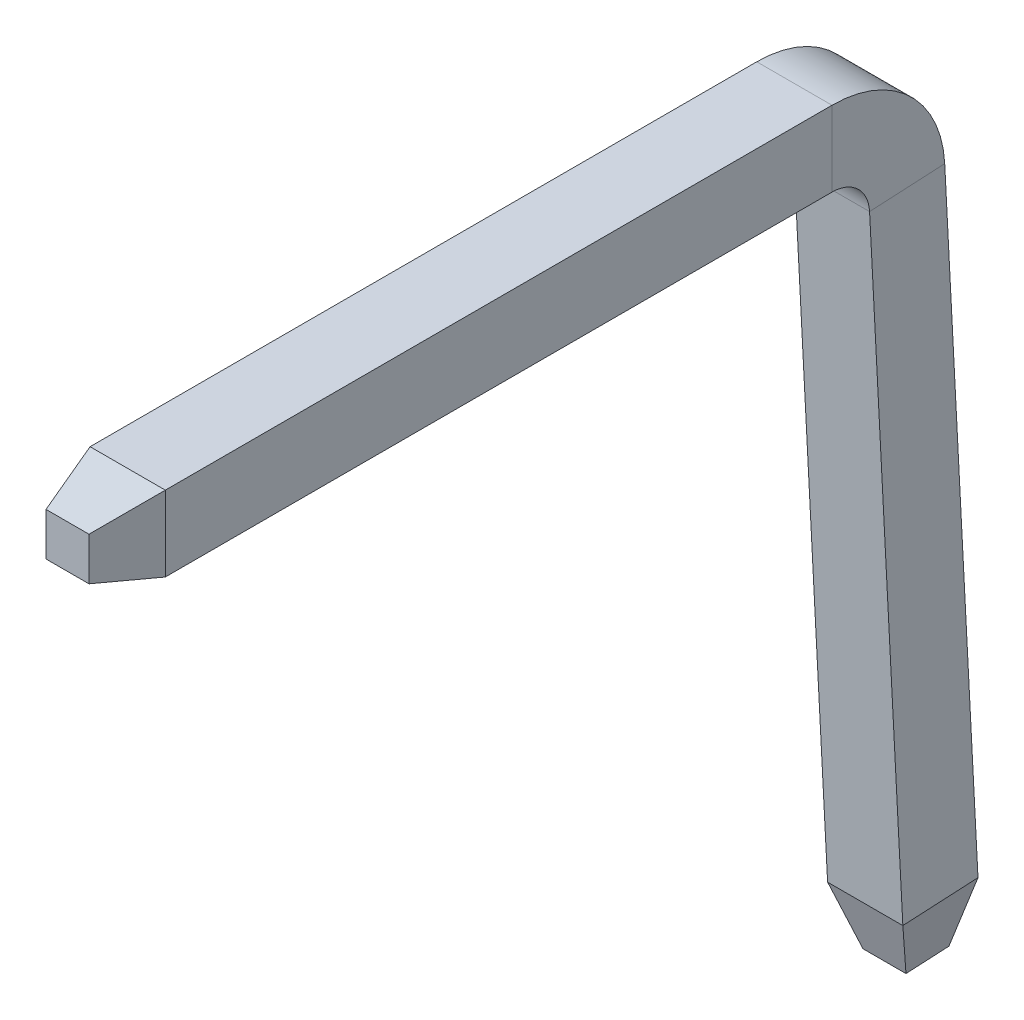
ISO-10303-21;
HEADER;
FILE_DESCRIPTION(('STEP AP214'),'2;1');
FILE_NAME('part.step','',(''),(''),'','','');
FILE_SCHEMA(('AUTOMOTIVE_DESIGN { 1 0 10303 214 1 1 1 1 }'));
ENDSEC;
DATA;
#1=APPLICATION_CONTEXT('core data for automotive mechanical design processes');
#2=APPLICATION_PROTOCOL_DEFINITION('international standard','automotive_design',2000,#1);
#3=PRODUCT_CONTEXT('',#1,'mechanical');
#4=PRODUCT('Part','Part','',(#3));
#5=PRODUCT_RELATED_PRODUCT_CATEGORY('part','',(#4));
#6=PRODUCT_DEFINITION_FORMATION('','',#4);
#7=PRODUCT_DEFINITION_CONTEXT('part definition',#1,'design');
#8=PRODUCT_DEFINITION('design','',#6,#7);
#9=PRODUCT_DEFINITION_SHAPE('','',#8);
#10=(LENGTH_UNIT() NAMED_UNIT(*) SI_UNIT(.MILLI.,.METRE.));
#11=(NAMED_UNIT(*) PLANE_ANGLE_UNIT() SI_UNIT($,.RADIAN.));
#12=(NAMED_UNIT(*) SI_UNIT($,.STERADIAN.) SOLID_ANGLE_UNIT());
#13=UNCERTAINTY_MEASURE_WITH_UNIT(LENGTH_MEASURE(1.E-05),#10,'distance_accuracy_value','');
#14=(GEOMETRIC_REPRESENTATION_CONTEXT(3) GLOBAL_UNCERTAINTY_ASSIGNED_CONTEXT((#13)) GLOBAL_UNIT_ASSIGNED_CONTEXT((#10,
#11,#12)) REPRESENTATION_CONTEXT('',''));
#15=CARTESIAN_POINT('',(0.,0.,0.));
#16=DIRECTION('',(0.,0.,1.));
#17=DIRECTION('',(1.,0.,0.));
#18=AXIS2_PLACEMENT_3D('',#15,#16,#17);
#19=CARTESIAN_POINT('',(115.271683739299,78.5058697660205,16.2562775900884));
#20=DIRECTION('',(0.965925826289341,0.,0.258819045101502));
#21=DIRECTION('',(0.,-1.,0.));
#22=AXIS2_PLACEMENT_3D('',#19,#20,#21);
#23=PLANE('',#22);
#24=DIRECTION('',(0.,1.,0.));
#25=VECTOR('',#24,1.);
#26=CARTESIAN_POINT('',(115.325273577785,78.2558697660205,16.0562775900884));
#27=LINE('',#26,#25);
#28=CARTESIAN_POINT('',(115.325273577785,78.2558697660205,16.0562775900884));
#29=VERTEX_POINT('',#28);
#30=CARTESIAN_POINT('',(115.325273577785,78.7558697660205,16.0562775900884));
#31=VERTEX_POINT('',#30);
#32=EDGE_CURVE('E214',#29,#31,#27,.T.);
#33=ORIENTED_EDGE('',*,*,#32,.T.);
#34=DIRECTION('',(-0.250562807084776,-0.250562807084838,0.935113126531525));
#35=VECTOR('',#34,1.);
#36=CARTESIAN_POINT('',(115.325273577785,78.7558697660205,16.0562775900884));
#37=LINE('',#36,#35);
#38=CARTESIAN_POINT('',(115.218093900813,78.6486900890485,16.4562775900884));
#39=VERTEX_POINT('',#38);
#40=EDGE_CURVE('E11',#31,#39,#37,.T.);
#41=ORIENTED_EDGE('',*,*,#40,.T.);
#42=DIRECTION('',(0.,-1.,0.));
#43=VECTOR('',#42,1.);
#44=CARTESIAN_POINT('',(115.218093900813,78.6486900890485,16.4562775900884));
#45=LINE('',#44,#43);
#46=CARTESIAN_POINT('',(115.218093900813,78.3630494429925,16.4562775900884));
#47=VERTEX_POINT('',#46);
#48=EDGE_CURVE('E169',#39,#47,#45,.T.);
#49=ORIENTED_EDGE('',*,*,#48,.T.);
#50=DIRECTION('',(0.250562807084781,-0.25056280708476,-0.935113126531544));
#51=VECTOR('',#50,1.);
#52=CARTESIAN_POINT('',(115.218093900813,78.3630494429925,16.4562775900884));
#53=LINE('',#52,#51);
#54=EDGE_CURVE('E50',#47,#29,#53,.T.);
#55=ORIENTED_EDGE('',*,*,#54,.T.);
#56=EDGE_LOOP('',(#33,#41,#49,#55));
#57=FACE_BOUND('',#56,.T.);
#58=ADVANCED_FACE('F40',(#57),#23,.T.);
#59=CARTESIAN_POINT('',(115.075273577785,78.7022799275345,16.2562775900884));
#60=DIRECTION('',(0.,0.965925826289331,0.25881904510154));
#61=DIRECTION('',(1.,0.,0.));
#62=AXIS2_PLACEMENT_3D('',#59,#60,#61);
#63=PLANE('',#62);
#64=DIRECTION('',(1.,0.,0.));
#65=VECTOR('',#64,1.);
#66=CARTESIAN_POINT('',(114.932453254757,78.6486900890485,16.4562775900884));
#67=LINE('',#66,#65);
#68=CARTESIAN_POINT('',(114.932453254757,78.6486900890485,16.4562775900884));
#69=VERTEX_POINT('',#68);
#70=EDGE_CURVE('E44',#69,#39,#67,.T.);
#71=ORIENTED_EDGE('',*,*,#70,.T.);
#72=ORIENTED_EDGE('',*,*,#40,.F.);
#73=DIRECTION('',(-1.,0.,0.));
#74=VECTOR('',#73,1.);
#75=CARTESIAN_POINT('',(115.325273577785,78.7558697660205,16.0562775900884));
#76=LINE('',#75,#74);
#77=CARTESIAN_POINT('',(114.825273577785,78.7558697660205,16.0562775900885));
#78=VERTEX_POINT('',#77);
#79=EDGE_CURVE('E185',#31,#78,#76,.T.);
#80=ORIENTED_EDGE('',*,*,#79,.T.);
#81=DIRECTION('',(0.250562807084861,-0.25056280708484,0.935113126531502));
#82=VECTOR('',#81,1.);
#83=CARTESIAN_POINT('',(114.825273577785,78.7558697660205,16.0562775900885));
#84=LINE('',#83,#82);
#85=EDGE_CURVE('E96',#78,#69,#84,.T.);
#86=ORIENTED_EDGE('',*,*,#85,.T.);
#87=EDGE_LOOP('',(#71,#72,#80,#86));
#88=FACE_BOUND('',#87,.T.);
#89=ADVANCED_FACE('F42',(#88),#63,.T.);
#90=CARTESIAN_POINT('',(115.075273577785,78.3094596045065,16.2562775900884));
#91=DIRECTION('',(0.,-0.965925826289338,0.258819045101513));
#92=DIRECTION('',(-1.,0.,0.));
#93=AXIS2_PLACEMENT_3D('',#90,#91,#92);
#94=PLANE('',#93);
#95=DIRECTION('',(1.,0.,0.));
#96=VECTOR('',#95,1.);
#97=CARTESIAN_POINT('',(114.825273577785,78.2558697660205,16.0562775900885));
#98=LINE('',#97,#96);
#99=CARTESIAN_POINT('',(114.825273577785,78.2558697660205,16.0562775900885));
#100=VERTEX_POINT('',#99);
#101=EDGE_CURVE('E190',#100,#29,#98,.T.);
#102=ORIENTED_EDGE('',*,*,#101,.T.);
#103=ORIENTED_EDGE('',*,*,#54,.F.);
#104=DIRECTION('',(-1.,0.,0.));
#105=VECTOR('',#104,1.);
#106=CARTESIAN_POINT('',(115.218093900813,78.3630494429925,16.4562775900884));
#107=LINE('',#106,#105);
#108=CARTESIAN_POINT('',(114.932453254757,78.3630494429925,16.4562775900884));
#109=VERTEX_POINT('',#108);
#110=EDGE_CURVE('E167',#47,#109,#107,.T.);
#111=ORIENTED_EDGE('',*,*,#110,.T.);
#112=DIRECTION('',(-0.250562807084866,-0.250562807084762,-0.935113126531521));
#113=VECTOR('',#112,1.);
#114=CARTESIAN_POINT('',(114.932453254757,78.3630494429925,16.4562775900884));
#115=LINE('',#114,#113);
#116=EDGE_CURVE('E144',#109,#100,#115,.T.);
#117=ORIENTED_EDGE('',*,*,#116,.T.);
#118=EDGE_LOOP('',(#102,#103,#111,#117));
#119=FACE_BOUND('',#118,.T.);
#120=ADVANCED_FACE('F277',(#119),#94,.T.);
#121=CARTESIAN_POINT('',(114.878863416271,78.5058697660205,16.2562775900884));
#122=DIRECTION('',(-0.965925826289328,0.,0.258819045101551));
#123=DIRECTION('',(0.,1.,0.));
#124=AXIS2_PLACEMENT_3D('',#121,#122,#123);
#125=PLANE('',#124);
#126=DIRECTION('',(0.,-1.,0.));
#127=VECTOR('',#126,1.);
#128=CARTESIAN_POINT('',(114.825273577785,78.7558697660205,16.0562775900885));
#129=LINE('',#128,#127);
#130=EDGE_CURVE('E159',#78,#100,#129,.T.);
#131=ORIENTED_EDGE('',*,*,#130,.T.);
#132=ORIENTED_EDGE('',*,*,#116,.F.);
#133=DIRECTION('',(0.,1.,0.));
#134=VECTOR('',#133,1.);
#135=CARTESIAN_POINT('',(114.932453254757,78.3630494429925,16.4562775900884));
#136=LINE('',#135,#134);
#137=EDGE_CURVE('E170',#109,#69,#136,.T.);
#138=ORIENTED_EDGE('',*,*,#137,.T.);
#139=ORIENTED_EDGE('',*,*,#85,.F.);
#140=EDGE_LOOP('',(#131,#132,#138,#139));
#141=FACE_BOUND('',#140,.T.);
#142=ADVANCED_FACE('F271',(#141),#125,.T.);
#143=CARTESIAN_POINT('',(115.271683739299,73.613070311148,10.8954677825284));
#144=DIRECTION('',(0.965925826289371,-0.258464342595238,-0.0135455422190501));
#145=DIRECTION('',(0.,0.0523359562421059,-0.998629534754618));
#146=AXIS2_PLACEMENT_3D('',#143,#144,#145);
#147=PLANE('',#146);
#148=DIRECTION('',(0.250562807084597,0.920718142383397,0.299159459138357));
#149=VECTOR('',#148,1.);
#150=CARTESIAN_POINT('',(115.218093900813,73.4058697660205,11.0276251840184));
#151=LINE('',#150,#149);
#152=CARTESIAN_POINT('',(115.218093900813,73.4058697660205,11.0276251840184));
#153=VERTEX_POINT('',#152);
#154=CARTESIAN_POINT('',(115.325273577785,73.7997122290385,11.1555923574655));
#155=VERTEX_POINT('',#154);
#156=EDGE_CURVE('E145',#153,#155,#151,.T.);
#157=ORIENTED_EDGE('',*,*,#156,.F.);
#158=DIRECTION('',(1.24377035546788E-13,-0.0523359562423446,0.998629534754605));
#159=VECTOR('',#158,1.);
#160=CARTESIAN_POINT('',(115.218093900813,73.4208190423735,10.7423759985414));
#161=LINE('',#160,#159);
#162=CARTESIAN_POINT('',(115.218093900813,73.4208190423735,10.7423759985414));
#163=VERTEX_POINT('',#162);
#164=EDGE_CURVE('E151',#163,#153,#161,.T.);
#165=ORIENTED_EDGE('',*,*,#164,.F.);
#166=DIRECTION('',(-0.250562807084773,-0.946945030598568,0.201279379794542));
#167=VECTOR('',#166,1.);
#168=CARTESIAN_POINT('',(115.325273577785,73.8258802071595,10.6562775900885));
#169=LINE('',#168,#167);
#170=CARTESIAN_POINT('',(115.325273577785,73.8258802071595,10.6562775900885));
#171=VERTEX_POINT('',#170);
#172=EDGE_CURVE('E133',#171,#163,#169,.T.);
#173=ORIENTED_EDGE('',*,*,#172,.F.);
#174=DIRECTION('',(0.,-0.0523359562420613,0.99862953475462));
#175=VECTOR('',#174,1.);
#176=CARTESIAN_POINT('',(115.325273577785,73.8258802071595,10.6562775900885));
#177=LINE('',#176,#175);
#178=EDGE_CURVE('E172',#171,#155,#177,.T.);
#179=ORIENTED_EDGE('',*,*,#178,.T.);
#180=EDGE_LOOP('',(#157,#165,#173,#179));
#181=FACE_BOUND('',#180,.T.);
#182=ADVANCED_FACE('F155',(#181),#147,.T.);
#183=CARTESIAN_POINT('',(115.075273577785,73.6233496247665,10.6993267943149));
#184=DIRECTION('',(0.,-0.207911690817772,-0.978147600733803));
#185=DIRECTION('',(0.,-0.978147600733803,0.207911690817772));
#186=AXIS2_PLACEMENT_3D('',#183,#184,#185);
#187=PLANE('',#186);
#188=DIRECTION('',(0.250562807084695,-0.946945030598588,0.201279379794547));
#189=VECTOR('',#188,1.);
#190=CARTESIAN_POINT('',(114.825273577785,73.8258802071595,10.6562775900885));
#191=LINE('',#190,#189);
#192=CARTESIAN_POINT('',(114.825273577785,73.8258802071595,10.6562775900885));
#193=VERTEX_POINT('',#192);
#194=CARTESIAN_POINT('',(114.932453254757,73.4208190423735,10.7423759985414));
#195=VERTEX_POINT('',#194);
#196=EDGE_CURVE('E240',#193,#195,#191,.T.);
#197=ORIENTED_EDGE('',*,*,#196,.F.);
#198=DIRECTION('',(1.,0.,0.));
#199=VECTOR('',#198,1.);
#200=CARTESIAN_POINT('',(114.825273577785,73.8258802071595,10.6562775900885));
#201=LINE('',#200,#199);
#202=EDGE_CURVE('E139',#193,#171,#201,.T.);
#203=ORIENTED_EDGE('',*,*,#202,.T.);
#204=ORIENTED_EDGE('',*,*,#172,.T.);
#205=DIRECTION('',(1.,0.,0.));
#206=VECTOR('',#205,1.);
#207=CARTESIAN_POINT('',(114.932453254757,73.4208190423735,10.7423759985414));
#208=LINE('',#207,#206);
#209=EDGE_CURVE('E136',#195,#163,#208,.T.);
#210=ORIENTED_EDGE('',*,*,#209,.F.);
#211=EDGE_LOOP('',(#197,#203,#204,#210));
#212=FACE_BOUND('',#211,.T.);
#213=ADVANCED_FACE('F135',(#212),#187,.T.);
#214=CARTESIAN_POINT('',(115.075273577785,73.6027909975295,11.091608770742));
#215=DIRECTION('',(0.,-0.309016994374012,0.951056516295458));
#216=DIRECTION('',(-1.,0.,0.));
#217=AXIS2_PLACEMENT_3D('',#214,#215,#216);
#218=PLANE('',#217);
#219=DIRECTION('',(-0.250562807084636,0.920718142383387,0.299159459138353));
#220=VECTOR('',#219,1.);
#221=CARTESIAN_POINT('',(114.932453254757,73.4058697660205,11.0276251840184));
#222=LINE('',#221,#220);
#223=CARTESIAN_POINT('',(114.932453254757,73.4058697660205,11.0276251840184));
#224=VERTEX_POINT('',#223);
#225=CARTESIAN_POINT('',(114.825273577785,73.7997122290385,11.1555923574655));
#226=VERTEX_POINT('',#225);
#227=EDGE_CURVE('E239',#224,#226,#222,.T.);
#228=ORIENTED_EDGE('',*,*,#227,.F.);
#229=DIRECTION('',(-1.,0.,0.));
#230=VECTOR('',#229,1.);
#231=CARTESIAN_POINT('',(115.218093900813,73.4058697660205,11.0276251840184));
#232=LINE('',#231,#230);
#233=EDGE_CURVE('E158',#153,#224,#232,.T.);
#234=ORIENTED_EDGE('',*,*,#233,.F.);
#235=ORIENTED_EDGE('',*,*,#156,.T.);
#236=DIRECTION('',(-1.,0.,0.));
#237=VECTOR('',#236,1.);
#238=CARTESIAN_POINT('',(115.325273577785,73.7997122290385,11.1555923574655));
#239=LINE('',#238,#237);
#240=EDGE_CURVE('E192',#155,#226,#239,.T.);
#241=ORIENTED_EDGE('',*,*,#240,.T.);
#242=EDGE_LOOP('',(#228,#234,#235,#241));
#243=FACE_BOUND('',#242,.T.);
#244=ADVANCED_FACE('F343',(#243),#218,.T.);
#245=CARTESIAN_POINT('',(114.878863416271,73.6130703111481,10.8954677825285));
#246=DIRECTION('',(-0.965925826289363,-0.258464342595269,-0.013545542219036));
#247=DIRECTION('',(-0.258488057599066,0.966014453348739,0.));
#248=AXIS2_PLACEMENT_3D('',#245,#246,#247);
#249=PLANE('',#248);
#250=ORIENTED_EDGE('',*,*,#196,.T.);
#251=DIRECTION('',(0.,0.0523359562423446,-0.998629534754605));
#252=VECTOR('',#251,1.);
#253=CARTESIAN_POINT('',(114.932453254757,73.4058697660205,11.0276251840184));
#254=LINE('',#253,#252);
#255=EDGE_CURVE('E153',#224,#195,#254,.T.);
#256=ORIENTED_EDGE('',*,*,#255,.F.);
#257=ORIENTED_EDGE('',*,*,#227,.T.);
#258=DIRECTION('',(0.,0.0523359562420613,-0.99862953475462));
#259=VECTOR('',#258,1.);
#260=CARTESIAN_POINT('',(114.825273577785,73.7997122290385,11.1555923574655));
#261=LINE('',#260,#259);
#262=EDGE_CURVE('E195',#226,#193,#261,.T.);
#263=ORIENTED_EDGE('',*,*,#262,.T.);
#264=EDGE_LOOP('',(#250,#256,#257,#263));
#265=FACE_BOUND('',#264,.T.);
#266=ADVANCED_FACE('F325',(#265),#249,.T.);
#267=CARTESIAN_POINT('',(115.075273577785,78.5058697660205,16.4562775900884));
#268=DIRECTION('',(0.,0.,1.));
#269=DIRECTION('',(1.,0.,0.));
#270=AXIS2_PLACEMENT_3D('',#267,#268,#269);
#271=PLANE('',#270);
#272=ORIENTED_EDGE('',*,*,#70,.F.);
#273=ORIENTED_EDGE('',*,*,#137,.F.);
#274=ORIENTED_EDGE('',*,*,#110,.F.);
#275=ORIENTED_EDGE('',*,*,#48,.F.);
#276=EDGE_LOOP('',(#272,#273,#274,#275));
#277=FACE_BOUND('',#276,.T.);
#278=ADVANCED_FACE('F275',(#277),#271,.T.);
#279=CARTESIAN_POINT('',(115.218093900813,73.413344404197,10.8850005912799));
#280=DIRECTION('',(0.,-0.9986295347546,-0.0523359562424376));
#281=DIRECTION('',(0.,0.0523359562424376,-0.9986295347546));
#282=AXIS2_PLACEMENT_3D('',#279,#280,#281);
#283=PLANE('',#282);
#284=ORIENTED_EDGE('',*,*,#164,.T.);
#285=ORIENTED_EDGE('',*,*,#233,.T.);
#286=ORIENTED_EDGE('',*,*,#255,.T.);
#287=ORIENTED_EDGE('',*,*,#209,.T.);
#288=EDGE_LOOP('',(#284,#285,#286,#287));
#289=FACE_BOUND('',#288,.T.);
#290=ADVANCED_FACE('F149',(#289),#283,.T.);
#291=CARTESIAN_POINT('',(114.825273577785,78.5058697660205,13.8413242049409));
#292=DIRECTION('',(-1.,0.,0.));
#293=DIRECTION('',(0.,1.,0.));
#294=AXIS2_PLACEMENT_3D('',#291,#292,#293);
#295=PLANE('',#294);
#296=DIRECTION('',(0.,0.,1.));
#297=VECTOR('',#296,1.);
#298=CARTESIAN_POINT('',(114.825273577785,78.2558697660205,11.6263708197935));
#299=LINE('',#298,#297);
#300=CARTESIAN_POINT('',(114.825273577785,78.2558697660205,11.6263708197935));
#301=VERTEX_POINT('',#300);
#302=EDGE_CURVE('E162',#301,#100,#299,.T.);
#303=ORIENTED_EDGE('',*,*,#302,.T.);
#304=ORIENTED_EDGE('',*,*,#130,.F.);
#305=DIRECTION('',(0.,0.,-1.));
#306=VECTOR('',#305,1.);
#307=CARTESIAN_POINT('',(114.825273577785,78.7558697660205,16.0562775900885));
#308=LINE('',#307,#306);
#309=CARTESIAN_POINT('',(114.825273577785,78.7558697660205,11.6263708197935));
#310=VERTEX_POINT('',#309);
#311=EDGE_CURVE('E188',#78,#310,#308,.T.);
#312=ORIENTED_EDGE('',*,*,#311,.T.);
#313=DIRECTION('',(0.,-1.,0.));
#314=VECTOR('',#313,1.);
#315=CARTESIAN_POINT('',(114.825273577785,78.7558697660205,11.6263708197935));
#316=LINE('',#315,#314);
#317=EDGE_CURVE('E237',#310,#301,#316,.T.);
#318=ORIENTED_EDGE('',*,*,#317,.T.);
#319=EDGE_LOOP('',(#303,#304,#312,#318));
#320=FACE_BOUND('',#319,.T.);
#321=ADVANCED_FACE('F284',(#320),#295,.T.);
#322=CARTESIAN_POINT('',(115.075273577785,78.2558697660205,13.8413242049409));
#323=DIRECTION('',(0.,-1.,0.));
#324=DIRECTION('',(0.,0.,-1.));
#325=AXIS2_PLACEMENT_3D('',#322,#323,#324);
#326=PLANE('',#325);
#327=DIRECTION('',(0.,0.,1.));
#328=VECTOR('',#327,1.);
#329=CARTESIAN_POINT('',(115.325273577785,78.2558697660205,11.6263708197935));
#330=LINE('',#329,#328);
#331=CARTESIAN_POINT('',(115.325273577785,78.2558697660205,11.6263708197935));
#332=VERTEX_POINT('',#331);
#333=EDGE_CURVE('E215',#332,#29,#330,.T.);
#334=ORIENTED_EDGE('',*,*,#333,.T.);
#335=ORIENTED_EDGE('',*,*,#101,.F.);
#336=ORIENTED_EDGE('',*,*,#302,.F.);
#337=DIRECTION('',(1.,0.,0.));
#338=VECTOR('',#337,1.);
#339=CARTESIAN_POINT('',(114.825273577785,78.2558697660205,11.6263708197935));
#340=LINE('',#339,#338);
#341=EDGE_CURVE('E180',#301,#332,#340,.T.);
#342=ORIENTED_EDGE('',*,*,#341,.T.);
#343=EDGE_LOOP('',(#334,#335,#336,#342));
#344=FACE_BOUND('',#343,.T.);
#345=ADVANCED_FACE('F280',(#344),#326,.T.);
#346=CARTESIAN_POINT('',(115.325273577785,78.5058697660205,13.8413242049409));
#347=DIRECTION('',(1.,0.,0.));
#348=DIRECTION('',(0.,0.,-1.));
#349=AXIS2_PLACEMENT_3D('',#346,#347,#348);
#350=PLANE('',#349);
#351=DIRECTION('',(0.,0.,1.));
#352=VECTOR('',#351,1.);
#353=CARTESIAN_POINT('',(115.325273577785,78.7558697660205,11.6263708197935));
#354=LINE('',#353,#352);
#355=CARTESIAN_POINT('',(115.325273577785,78.7558697660205,11.6263708197935));
#356=VERTEX_POINT('',#355);
#357=EDGE_CURVE('E187',#356,#31,#354,.T.);
#358=ORIENTED_EDGE('',*,*,#357,.T.);
#359=ORIENTED_EDGE('',*,*,#32,.F.);
#360=ORIENTED_EDGE('',*,*,#333,.F.);
#361=DIRECTION('',(0.,1.,0.));
#362=VECTOR('',#361,1.);
#363=CARTESIAN_POINT('',(115.325273577785,78.2558697660205,11.6263708197935));
#364=LINE('',#363,#362);
#365=EDGE_CURVE('E205',#332,#356,#364,.T.);
#366=ORIENTED_EDGE('',*,*,#365,.T.);
#367=EDGE_LOOP('',(#358,#359,#360,#366));
#368=FACE_BOUND('',#367,.T.);
#369=ADVANCED_FACE('F262',(#368),#350,.T.);
#370=CARTESIAN_POINT('',(115.075273577785,78.7558697660205,13.8413242049409));
#371=DIRECTION('',(0.,1.,0.));
#372=DIRECTION('',(1.,0.,0.));
#373=AXIS2_PLACEMENT_3D('',#370,#371,#372);
#374=PLANE('',#373);
#375=ORIENTED_EDGE('',*,*,#311,.F.);
#376=ORIENTED_EDGE('',*,*,#79,.F.);
#377=ORIENTED_EDGE('',*,*,#357,.F.);
#378=DIRECTION('',(1.,0.,0.));
#379=VECTOR('',#378,1.);
#380=CARTESIAN_POINT('',(114.825273577785,78.7558697660205,11.6263708197935));
#381=LINE('',#380,#379);
#382=EDGE_CURVE('E202',#310,#356,#381,.T.);
#383=ORIENTED_EDGE('',*,*,#382,.F.);
#384=EDGE_LOOP('',(#375,#376,#377,#383));
#385=FACE_BOUND('',#384,.T.);
#386=ADVANCED_FACE('F268',(#385),#374,.T.);
#387=CARTESIAN_POINT('',(114.825273577785,78.387411760551,11.2518847442603));
#388=DIRECTION('',(-1.,0.,0.));
#389=DIRECTION('',(0.,1.,0.));
#390=AXIS2_PLACEMENT_3D('',#387,#388,#389);
#391=PLANE('',#390);
#392=ORIENTED_EDGE('',*,*,#317,.F.);
#393=CARTESIAN_POINT('',(114.825273577785,78.0058697660205,11.6263708197931));
#394=DIRECTION('',(1.,0.,0.));
#395=DIRECTION('',(0.,1.,4.26325641456024E-13));
#396=AXIS2_PLACEMENT_3D('',#393,#394,#395);
#397=CIRCLE('',#396,0.750000000000064);
#398=CARTESIAN_POINT('',(114.825273577785,78.0451217332025,10.8773986687271));
#399=VERTEX_POINT('',#398);
#400=EDGE_CURVE('E178',#399,#310,#397,.T.);
#401=ORIENTED_EDGE('',*,*,#400,.F.);
#402=DIRECTION('',(0.,-0.0523359562419563,0.998629534754626));
#403=VECTOR('',#402,1.);
#404=CARTESIAN_POINT('',(114.825273577785,78.0451217332025,10.8773986687271));
#405=LINE('',#404,#403);
#406=CARTESIAN_POINT('',(114.825273577785,78.0189537550815,11.3767134361045));
#407=VERTEX_POINT('',#406);
#408=EDGE_CURVE('E179',#399,#407,#405,.T.);
#409=ORIENTED_EDGE('',*,*,#408,.T.);
#410=CARTESIAN_POINT('',(114.825273577785,78.0058697660204,11.6263708197932));
#411=DIRECTION('',(1.,2.13162820728095E-13,-1.78098943346508E-13));
#412=DIRECTION('',(-2.13162820727921E-13,1.,9.76996261669638E-13));
#413=AXIS2_PLACEMENT_3D('',#410,#411,#412);
#414=CIRCLE('',#413,0.250000000000128);
#415=EDGE_CURVE('E183',#407,#301,#414,.T.);
#416=ORIENTED_EDGE('',*,*,#415,.T.);
#417=EDGE_LOOP('',(#392,#401,#409,#416));
#418=FACE_BOUND('',#417,.T.);
#419=ADVANCED_FACE('F286',(#418),#391,.T.);
#420=CARTESIAN_POINT('',(115.075273577785,78.0058697660198,11.6263708197935));
#421=DIRECTION('',(-1.,0.,0.));
#422=DIRECTION('',(0.,1.,0.));
#423=AXIS2_PLACEMENT_3D('',#420,#421,#422);
#424=CYLINDRICAL_SURFACE('',#423,0.250000000000741);
#425=ORIENTED_EDGE('',*,*,#341,.F.);
#426=ORIENTED_EDGE('',*,*,#415,.F.);
#427=DIRECTION('',(1.,0.,0.));
#428=VECTOR('',#427,1.);
#429=CARTESIAN_POINT('',(114.825273577785,78.0189537550815,11.3767134361045));
#430=LINE('',#429,#428);
#431=CARTESIAN_POINT('',(115.325273577785,78.0189537550815,11.3767134361045));
#432=VERTEX_POINT('',#431);
#433=EDGE_CURVE('E229',#407,#432,#430,.T.);
#434=ORIENTED_EDGE('',*,*,#433,.T.);
#435=CARTESIAN_POINT('',(115.325273577785,78.0058697660204,11.6263708197932));
#436=DIRECTION('',(1.,0.,0.));
#437=DIRECTION('',(0.,1.,9.76996261669638E-13));
#438=AXIS2_PLACEMENT_3D('',#435,#436,#437);
#439=CIRCLE('',#438,0.250000000000128);
#440=EDGE_CURVE('E184',#432,#332,#439,.T.);
#441=ORIENTED_EDGE('',*,*,#440,.T.);
#442=EDGE_LOOP('',(#425,#426,#434,#441));
#443=FACE_BOUND('',#442,.T.);
#444=ADVANCED_FACE('F257',(#443),#424,.F.);
#445=CARTESIAN_POINT('',(115.325273577785,78.387411760551,11.2518847442603));
#446=DIRECTION('',(1.,0.,0.));
#447=DIRECTION('',(0.,0.,-1.));
#448=AXIS2_PLACEMENT_3D('',#445,#446,#447);
#449=PLANE('',#448);
#450=ORIENTED_EDGE('',*,*,#365,.F.);
#451=ORIENTED_EDGE('',*,*,#440,.F.);
#452=DIRECTION('',(0.,0.0523359562419563,-0.998629534754626));
#453=VECTOR('',#452,1.);
#454=CARTESIAN_POINT('',(115.325273577785,78.0189537550815,11.3767134361045));
#455=LINE('',#454,#453);
#456=CARTESIAN_POINT('',(115.325273577785,78.0451217332025,10.8773986687271));
#457=VERTEX_POINT('',#456);
#458=EDGE_CURVE('E174',#432,#457,#455,.T.);
#459=ORIENTED_EDGE('',*,*,#458,.T.);
#460=CARTESIAN_POINT('',(115.325273577785,78.0058697660205,11.6263708197931));
#461=DIRECTION('',(-1.,0.,0.));
#462=DIRECTION('',(0.,0.0523359562427295,-0.998629534754585));
#463=AXIS2_PLACEMENT_3D('',#460,#461,#462);
#464=CIRCLE('',#463,0.750000000000058);
#465=EDGE_CURVE('E176',#356,#457,#464,.T.);
#466=ORIENTED_EDGE('',*,*,#465,.F.);
#467=EDGE_LOOP('',(#450,#451,#459,#466));
#468=FACE_BOUND('',#467,.T.);
#469=ADVANCED_FACE('F261',(#468),#449,.T.);
#470=CARTESIAN_POINT('',(115.325273577785,78.0058697660201,11.6263708197932));
#471=DIRECTION('',(1.,0.,0.));
#472=DIRECTION('',(0.,0.725374371012364,-0.688354575693674));
#473=AXIS2_PLACEMENT_3D('',#470,#471,#472);
#474=CYLINDRICAL_SURFACE('',#473,0.750000000000422);
#475=ORIENTED_EDGE('',*,*,#465,.T.);
#476=DIRECTION('',(-1.,0.,0.));
#477=VECTOR('',#476,1.);
#478=CARTESIAN_POINT('',(115.325273577785,78.0451217332025,10.8773986687271));
#479=LINE('',#478,#477);
#480=EDGE_CURVE('E210',#457,#399,#479,.T.);
#481=ORIENTED_EDGE('',*,*,#480,.T.);
#482=ORIENTED_EDGE('',*,*,#400,.T.);
#483=ORIENTED_EDGE('',*,*,#382,.T.);
#484=EDGE_LOOP('',(#475,#481,#482,#483));
#485=FACE_BOUND('',#484,.T.);
#486=ADVANCED_FACE('F265',(#485),#474,.T.);
#487=CARTESIAN_POINT('',(114.825273577785,75.9224169811205,11.0164955130965));
#488=DIRECTION('',(-1.,0.,0.));
#489=DIRECTION('',(0.,1.,0.));
#490=AXIS2_PLACEMENT_3D('',#487,#488,#489);
#491=PLANE('',#490);
#492=ORIENTED_EDGE('',*,*,#262,.F.);
#493=DIRECTION('',(0.,0.99862953475457,0.0523359562430139));
#494=VECTOR('',#493,1.);
#495=CARTESIAN_POINT('',(114.825273577785,73.7997122290385,11.1555923574655));
#496=LINE('',#495,#494);
#497=EDGE_CURVE('E196',#226,#407,#496,.T.);
#498=ORIENTED_EDGE('',*,*,#497,.T.);
#499=ORIENTED_EDGE('',*,*,#408,.F.);
#500=DIRECTION('',(0.,-0.998629534754574,-0.0523359562429373));
#501=VECTOR('',#500,1.);
#502=CARTESIAN_POINT('',(114.825273577785,78.0451217332025,10.8773986687271));
#503=LINE('',#502,#501);
#504=EDGE_CURVE('E213',#399,#193,#503,.T.);
#505=ORIENTED_EDGE('',*,*,#504,.T.);
#506=EDGE_LOOP('',(#492,#498,#499,#505));
#507=FACE_BOUND('',#506,.T.);
#508=ADVANCED_FACE('F291',(#507),#491,.T.);
#509=CARTESIAN_POINT('',(115.075273577785,75.90933299206,11.2661528967849));
#510=DIRECTION('',(0.,-0.0523359562430137,0.99862953475457));
#511=DIRECTION('',(-1.,-2.27847999689658E-13,0.));
#512=AXIS2_PLACEMENT_3D('',#509,#510,#511);
#513=PLANE('',#512);
#514=ORIENTED_EDGE('',*,*,#433,.F.);
#515=ORIENTED_EDGE('',*,*,#497,.F.);
#516=ORIENTED_EDGE('',*,*,#240,.F.);
#517=DIRECTION('',(0.,0.99862953475457,0.0523359562430139));
#518=VECTOR('',#517,1.);
#519=CARTESIAN_POINT('',(115.325273577785,73.7997122290385,11.1555923574655));
#520=LINE('',#519,#518);
#521=EDGE_CURVE('E232',#155,#432,#520,.T.);
#522=ORIENTED_EDGE('',*,*,#521,.T.);
#523=EDGE_LOOP('',(#514,#515,#516,#522));
#524=FACE_BOUND('',#523,.T.);
#525=ADVANCED_FACE('F294',(#524),#513,.T.);
#526=CARTESIAN_POINT('',(115.325273577785,75.9224169811205,11.0164955130964));
#527=DIRECTION('',(1.,0.,0.));
#528=DIRECTION('',(0.,0.,-1.));
#529=AXIS2_PLACEMENT_3D('',#526,#527,#528);
#530=PLANE('',#529);
#531=ORIENTED_EDGE('',*,*,#178,.F.);
#532=DIRECTION('',(0.,0.998629534754574,0.0523359562429373));
#533=VECTOR('',#532,1.);
#534=CARTESIAN_POINT('',(115.325273577785,73.8258802071595,10.6562775900885));
#535=LINE('',#534,#533);
#536=EDGE_CURVE('E175',#171,#457,#535,.T.);
#537=ORIENTED_EDGE('',*,*,#536,.T.);
#538=ORIENTED_EDGE('',*,*,#458,.F.);
#539=ORIENTED_EDGE('',*,*,#521,.F.);
#540=EDGE_LOOP('',(#531,#537,#538,#539));
#541=FACE_BOUND('',#540,.T.);
#542=ADVANCED_FACE('F298',(#541),#530,.T.);
#543=CARTESIAN_POINT('',(115.075273577785,75.935500970181,10.7668381294078));
#544=DIRECTION('',(0.,0.0523359562429381,-0.998629534754574));
#545=DIRECTION('',(-1.,0.,0.));
#546=AXIS2_PLACEMENT_3D('',#543,#544,#545);
#547=PLANE('',#546);
#548=ORIENTED_EDGE('',*,*,#202,.F.);
#549=ORIENTED_EDGE('',*,*,#504,.F.);
#550=ORIENTED_EDGE('',*,*,#480,.F.);
#551=ORIENTED_EDGE('',*,*,#536,.F.);
#552=EDGE_LOOP('',(#548,#549,#550,#551));
#553=FACE_BOUND('',#552,.T.);
#554=ADVANCED_FACE('F303',(#553),#547,.T.);
#555=CLOSED_SHELL('',(#58,#89,#120,#142,#182,#213,#244,#266,#278,#290,#321,#345,#369,#386,#419,
#444,#469,#486,#508,#525,#542,#554));
#556=MANIFOLD_SOLID_BREP('B2',#555);
#557=ADVANCED_BREP_SHAPE_REPRESENTATION('',(#18,#556),#14);
#558=SHAPE_DEFINITION_REPRESENTATION(#9,#557);
ENDSEC;
END-ISO-10303-21;
